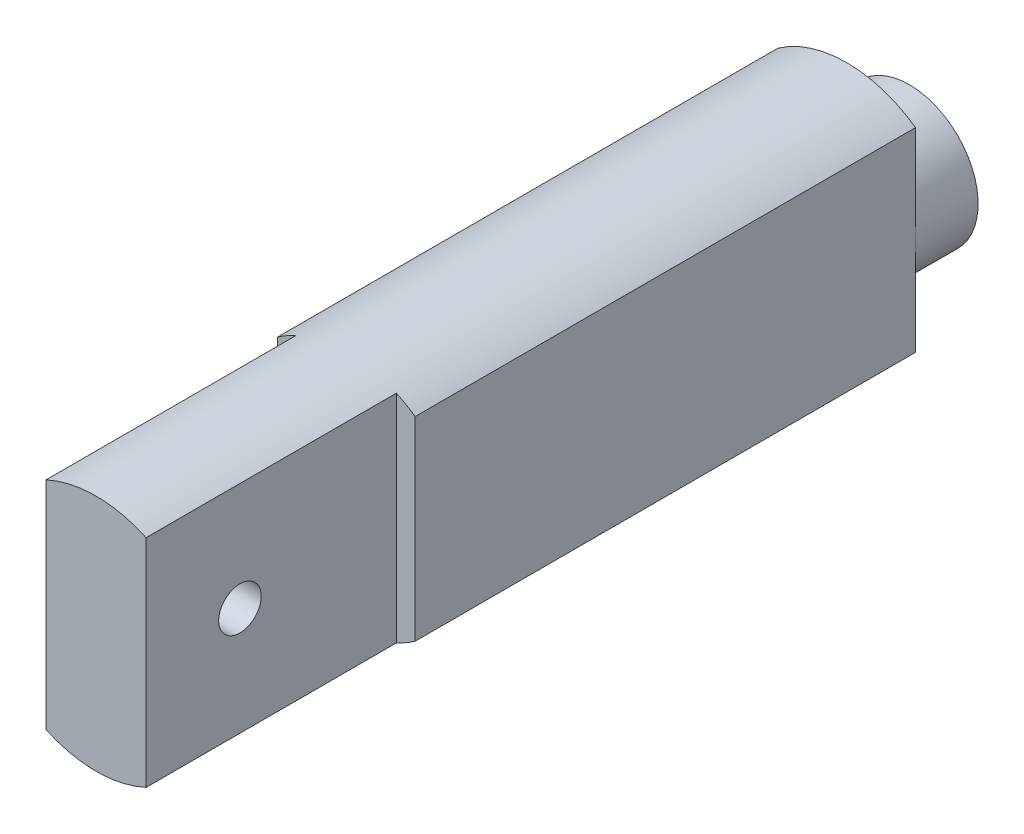
ISO-10303-21;
HEADER;
FILE_DESCRIPTION(('STEP AP214'),'2;1');
FILE_NAME('part.step','',(''),(''),'','','');
FILE_SCHEMA(('AUTOMOTIVE_DESIGN { 1 0 10303 214 1 1 1 1 }'));
ENDSEC;
DATA;
#1=APPLICATION_CONTEXT('core data for automotive mechanical design processes');
#2=APPLICATION_PROTOCOL_DEFINITION('international standard','automotive_design',2000,#1);
#3=PRODUCT_CONTEXT('',#1,'mechanical');
#4=PRODUCT('Part','Part','',(#3));
#5=PRODUCT_RELATED_PRODUCT_CATEGORY('part','',(#4));
#6=PRODUCT_DEFINITION_FORMATION('','',#4);
#7=PRODUCT_DEFINITION_CONTEXT('part definition',#1,'design');
#8=PRODUCT_DEFINITION('design','',#6,#7);
#9=PRODUCT_DEFINITION_SHAPE('','',#8);
#10=(LENGTH_UNIT() NAMED_UNIT(*) SI_UNIT(.MILLI.,.METRE.));
#11=(NAMED_UNIT(*) PLANE_ANGLE_UNIT() SI_UNIT($,.RADIAN.));
#12=(NAMED_UNIT(*) SI_UNIT($,.STERADIAN.) SOLID_ANGLE_UNIT());
#13=UNCERTAINTY_MEASURE_WITH_UNIT(LENGTH_MEASURE(1.E-05),#10,'distance_accuracy_value','');
#14=(GEOMETRIC_REPRESENTATION_CONTEXT(3) GLOBAL_UNCERTAINTY_ASSIGNED_CONTEXT((#13)) GLOBAL_UNIT_ASSIGNED_CONTEXT((#10,
#11,#12)) REPRESENTATION_CONTEXT('',''));
#15=CARTESIAN_POINT('',(0.,0.,0.));
#16=DIRECTION('',(0.,0.,1.));
#17=DIRECTION('',(1.,0.,0.));
#18=AXIS2_PLACEMENT_3D('',#15,#16,#17);
#19=CARTESIAN_POINT('',(0.,0.,120.));
#20=DIRECTION('',(0.,0.,-1.));
#21=DIRECTION('',(-1.,0.,0.));
#22=AXIS2_PLACEMENT_3D('',#19,#20,#21);
#23=CYLINDRICAL_SURFACE('',#22,19.05);
#24=CARTESIAN_POINT('',(0.,0.,80.));
#25=DIRECTION('',(0.,0.,1.));
#26=DIRECTION('',(1.,0.,0.));
#27=AXIS2_PLACEMENT_3D('',#24,#25,#26);
#28=CIRCLE('',#27,19.05);
#29=CARTESIAN_POINT('',(-8.,17.2887969506267,80.));
#30=VERTEX_POINT('',#29);
#31=CARTESIAN_POINT('',(-11.,15.5532151017081,80.));
#32=VERTEX_POINT('',#31);
#33=EDGE_CURVE('E68',#30,#32,#28,.T.);
#34=ORIENTED_EDGE('',*,*,#33,.F.);
#35=DIRECTION('',(0.,0.,-1.));
#36=VECTOR('',#35,1.);
#37=CARTESIAN_POINT('',(-8.,17.2887969506267,120.));
#38=LINE('',#37,#36);
#39=CARTESIAN_POINT('',(-8.,17.2887969506267,120.));
#40=VERTEX_POINT('',#39);
#41=EDGE_CURVE('E143',#40,#30,#38,.T.);
#42=ORIENTED_EDGE('',*,*,#41,.F.);
#43=CARTESIAN_POINT('',(0.,0.,120.));
#44=DIRECTION('',(0.,0.,1.));
#45=DIRECTION('',(1.,0.,0.));
#46=AXIS2_PLACEMENT_3D('',#43,#44,#45);
#47=CIRCLE('',#46,19.05);
#48=CARTESIAN_POINT('',(8.,17.2887969506267,120.));
#49=VERTEX_POINT('',#48);
#50=EDGE_CURVE('E126',#49,#40,#47,.T.);
#51=ORIENTED_EDGE('',*,*,#50,.F.);
#52=DIRECTION('',(0.,0.,-1.));
#53=VECTOR('',#52,1.);
#54=CARTESIAN_POINT('',(8.,17.2887969506267,120.));
#55=LINE('',#54,#53);
#56=CARTESIAN_POINT('',(8.,17.2887969506267,80.));
#57=VERTEX_POINT('',#56);
#58=EDGE_CURVE('E157',#57,#49,#55,.F.);
#59=ORIENTED_EDGE('',*,*,#58,.F.);
#60=CARTESIAN_POINT('',(11.,15.5532151017081,80.));
#61=VERTEX_POINT('',#60);
#62=EDGE_CURVE('E289',#61,#57,#28,.T.);
#63=ORIENTED_EDGE('',*,*,#62,.F.);
#64=DIRECTION('',(0.,0.,-1.));
#65=VECTOR('',#64,1.);
#66=CARTESIAN_POINT('',(11.,15.5532151017081,120.));
#67=LINE('',#66,#65);
#68=CARTESIAN_POINT('',(11.,15.5532151017081,0.));
#69=VERTEX_POINT('',#68);
#70=EDGE_CURVE('E173',#69,#61,#67,.F.);
#71=ORIENTED_EDGE('',*,*,#70,.F.);
#72=CARTESIAN_POINT('',(0.,0.,0.));
#73=DIRECTION('',(0.,0.,1.));
#74=DIRECTION('',(1.,0.,0.));
#75=AXIS2_PLACEMENT_3D('',#72,#73,#74);
#76=CIRCLE('',#75,19.05);
#77=CARTESIAN_POINT('',(-11.,15.5532151017081,0.));
#78=VERTEX_POINT('',#77);
#79=EDGE_CURVE('E187',#69,#78,#76,.T.);
#80=ORIENTED_EDGE('',*,*,#79,.T.);
#81=DIRECTION('',(0.,0.,-1.));
#82=VECTOR('',#81,1.);
#83=CARTESIAN_POINT('',(-11.,15.5532151017081,120.));
#84=LINE('',#83,#82);
#85=EDGE_CURVE('E170',#32,#78,#84,.T.);
#86=ORIENTED_EDGE('',*,*,#85,.F.);
#87=EDGE_LOOP('',(#34,#42,#51,#59,#63,#71,#80,#86));
#88=FACE_BOUND('',#87,.T.);
#89=ADVANCED_FACE('F53',(#88),#23,.T.);
#90=CARTESIAN_POINT('',(0.,0.,80.));
#91=DIRECTION('',(0.,0.,1.));
#92=DIRECTION('',(1.,0.,0.));
#93=AXIS2_PLACEMENT_3D('',#90,#91,#92);
#94=CIRCLE('',#93,19.05);
#95=CARTESIAN_POINT('',(-11.,-15.5532151017081,80.));
#96=VERTEX_POINT('',#95);
#97=CARTESIAN_POINT('',(-8.,-17.2887969506267,80.));
#98=VERTEX_POINT('',#97);
#99=EDGE_CURVE('E290',#96,#98,#94,.T.);
#100=ORIENTED_EDGE('',*,*,#99,.F.);
#101=DIRECTION('',(0.,0.,-1.));
#102=VECTOR('',#101,1.);
#103=CARTESIAN_POINT('',(-11.,-15.5532151017081,120.));
#104=LINE('',#103,#102);
#105=CARTESIAN_POINT('',(-11.,-15.5532151017081,0.));
#106=VERTEX_POINT('',#105);
#107=EDGE_CURVE('E166',#106,#96,#104,.F.);
#108=ORIENTED_EDGE('',*,*,#107,.F.);
#109=CARTESIAN_POINT('',(11.,-15.5532151017081,0.));
#110=VERTEX_POINT('',#109);
#111=EDGE_CURVE('E184',#106,#110,#76,.T.);
#112=ORIENTED_EDGE('',*,*,#111,.T.);
#113=DIRECTION('',(0.,0.,-1.));
#114=VECTOR('',#113,1.);
#115=CARTESIAN_POINT('',(11.,-15.5532151017081,120.));
#116=LINE('',#115,#114);
#117=CARTESIAN_POINT('',(11.,-15.5532151017081,80.));
#118=VERTEX_POINT('',#117);
#119=EDGE_CURVE('E177',#118,#110,#116,.T.);
#120=ORIENTED_EDGE('',*,*,#119,.F.);
#121=CARTESIAN_POINT('',(8.,-17.2887969506267,80.));
#122=VERTEX_POINT('',#121);
#123=EDGE_CURVE('E76',#122,#118,#94,.T.);
#124=ORIENTED_EDGE('',*,*,#123,.F.);
#125=DIRECTION('',(0.,0.,-1.));
#126=VECTOR('',#125,1.);
#127=CARTESIAN_POINT('',(8.,-17.2887969506267,120.));
#128=LINE('',#127,#126);
#129=CARTESIAN_POINT('',(8.,-17.2887969506267,120.));
#130=VERTEX_POINT('',#129);
#131=EDGE_CURVE('E296',#130,#122,#128,.T.);
#132=ORIENTED_EDGE('',*,*,#131,.F.);
#133=CARTESIAN_POINT('',(-8.,-17.2887969506267,120.));
#134=VERTEX_POINT('',#133);
#135=EDGE_CURVE('E138',#134,#130,#47,.T.);
#136=ORIENTED_EDGE('',*,*,#135,.F.);
#137=DIRECTION('',(0.,0.,-1.));
#138=VECTOR('',#137,1.);
#139=CARTESIAN_POINT('',(-8.,-17.2887969506267,120.));
#140=LINE('',#139,#138);
#141=EDGE_CURVE('E145',#98,#134,#140,.F.);
#142=ORIENTED_EDGE('',*,*,#141,.F.);
#143=EDGE_LOOP('',(#100,#108,#112,#120,#124,#132,#136,#142));
#144=FACE_BOUND('',#143,.T.);
#145=ADVANCED_FACE('F200',(#144),#23,.T.);
#146=CARTESIAN_POINT('',(0.,0.,120.));
#147=DIRECTION('',(0.,0.,1.));
#148=DIRECTION('',(1.,0.,0.));
#149=AXIS2_PLACEMENT_3D('',#146,#147,#148);
#150=PLANE('',#149);
#151=ORIENTED_EDGE('',*,*,#50,.T.);
#152=DIRECTION('',(0.,-1.,0.));
#153=VECTOR('',#152,1.);
#154=CARTESIAN_POINT('',(-8.,19.05,120.));
#155=LINE('',#154,#153);
#156=EDGE_CURVE('E129',#40,#134,#155,.T.);
#157=ORIENTED_EDGE('',*,*,#156,.T.);
#158=ORIENTED_EDGE('',*,*,#135,.T.);
#159=DIRECTION('',(0.,1.,0.));
#160=VECTOR('',#159,1.);
#161=CARTESIAN_POINT('',(8.,19.05,120.));
#162=LINE('',#161,#160);
#163=EDGE_CURVE('E132',#130,#49,#162,.T.);
#164=ORIENTED_EDGE('',*,*,#163,.T.);
#165=EDGE_LOOP('',(#151,#157,#158,#164));
#166=FACE_BOUND('',#165,.T.);
#167=ADVANCED_FACE('F128',(#166),#150,.T.);
#168=CARTESIAN_POINT('',(-11.,19.05,120.));
#169=DIRECTION('',(-1.,0.,0.));
#170=DIRECTION('',(0.,0.,1.));
#171=AXIS2_PLACEMENT_3D('',#168,#169,#170);
#172=PLANE('',#171);
#173=ORIENTED_EDGE('',*,*,#107,.T.);
#174=DIRECTION('',(0.,1.,0.));
#175=VECTOR('',#174,1.);
#176=CARTESIAN_POINT('',(-11.,19.05,80.));
#177=LINE('',#176,#175);
#178=EDGE_CURVE('E293',#96,#32,#177,.T.);
#179=ORIENTED_EDGE('',*,*,#178,.T.);
#180=ORIENTED_EDGE('',*,*,#85,.T.);
#181=DIRECTION('',(0.,1.,0.));
#182=VECTOR('',#181,1.);
#183=CARTESIAN_POINT('',(-11.,19.05,0.));
#184=LINE('',#183,#182);
#185=CARTESIAN_POINT('',(-11.,0.,0.));
#186=VERTEX_POINT('',#185);
#187=EDGE_CURVE('E161',#186,#78,#184,.T.);
#188=ORIENTED_EDGE('',*,*,#187,.F.);
#189=EDGE_CURVE('E165',#106,#186,#184,.T.);
#190=ORIENTED_EDGE('',*,*,#189,.F.);
#191=EDGE_LOOP('',(#173,#179,#180,#188,#190));
#192=FACE_BOUND('',#191,.T.);
#193=ADVANCED_FACE('F238',(#192),#172,.T.);
#194=CARTESIAN_POINT('',(11.,19.05,120.));
#195=DIRECTION('',(1.,0.,0.));
#196=DIRECTION('',(0.,0.,-1.));
#197=AXIS2_PLACEMENT_3D('',#194,#195,#196);
#198=PLANE('',#197);
#199=ORIENTED_EDGE('',*,*,#70,.T.);
#200=DIRECTION('',(0.,-1.,0.));
#201=VECTOR('',#200,1.);
#202=CARTESIAN_POINT('',(11.,19.05,80.));
#203=LINE('',#202,#201);
#204=EDGE_CURVE('E14',#61,#118,#203,.T.);
#205=ORIENTED_EDGE('',*,*,#204,.T.);
#206=ORIENTED_EDGE('',*,*,#119,.T.);
#207=DIRECTION('',(0.,-1.,0.));
#208=VECTOR('',#207,1.);
#209=CARTESIAN_POINT('',(11.,19.05,0.));
#210=LINE('',#209,#208);
#211=CARTESIAN_POINT('',(11.,0.,0.));
#212=VERTEX_POINT('',#211);
#213=EDGE_CURVE('E150',#212,#110,#210,.T.);
#214=ORIENTED_EDGE('',*,*,#213,.F.);
#215=EDGE_CURVE('E155',#69,#212,#210,.T.);
#216=ORIENTED_EDGE('',*,*,#215,.F.);
#217=EDGE_LOOP('',(#199,#205,#206,#214,#216));
#218=FACE_BOUND('',#217,.T.);
#219=ADVANCED_FACE('F208',(#218),#198,.T.);
#220=CARTESIAN_POINT('',(0.,0.,0.));
#221=DIRECTION('',(0.,0.,1.));
#222=DIRECTION('',(1.,0.,0.));
#223=AXIS2_PLACEMENT_3D('',#220,#221,#222);
#224=PLANE('',#223);
#225=ORIENTED_EDGE('',*,*,#213,.T.);
#226=ORIENTED_EDGE('',*,*,#111,.F.);
#227=ORIENTED_EDGE('',*,*,#189,.T.);
#228=CARTESIAN_POINT('',(0.,0.,0.));
#229=DIRECTION('',(0.,0.,-1.));
#230=DIRECTION('',(-1.,0.,0.));
#231=AXIS2_PLACEMENT_3D('',#228,#229,#230);
#232=CIRCLE('',#231,11.);
#233=EDGE_CURVE('E137',#212,#186,#232,.T.);
#234=ORIENTED_EDGE('',*,*,#233,.F.);
#235=EDGE_LOOP('',(#225,#226,#227,#234));
#236=FACE_BOUND('',#235,.T.);
#237=ADVANCED_FACE('F204',(#236),#224,.F.);
#238=ORIENTED_EDGE('',*,*,#215,.T.);
#239=EDGE_CURVE('E61',#186,#212,#232,.T.);
#240=ORIENTED_EDGE('',*,*,#239,.F.);
#241=ORIENTED_EDGE('',*,*,#187,.T.);
#242=ORIENTED_EDGE('',*,*,#79,.F.);
#243=EDGE_LOOP('',(#238,#240,#241,#242));
#244=FACE_BOUND('',#243,.T.);
#245=ADVANCED_FACE('F211',(#244),#224,.F.);
#246=CARTESIAN_POINT('',(0.,0.,-10.));
#247=DIRECTION('',(0.,0.,1.));
#248=DIRECTION('',(1.,0.,0.));
#249=AXIS2_PLACEMENT_3D('',#246,#247,#248);
#250=CYLINDRICAL_SURFACE('',#249,11.);
#251=CARTESIAN_POINT('',(0.,0.,-10.));
#252=DIRECTION('',(0.,0.,-1.));
#253=DIRECTION('',(-1.,0.,0.));
#254=AXIS2_PLACEMENT_3D('',#251,#252,#253);
#255=CIRCLE('',#254,11.);
#256=CARTESIAN_POINT('',(-11.,0.,-10.));
#257=VERTEX_POINT('',#256);
#258=EDGE_CURVE('E180',#257,#257,#255,.T.);
#259=ORIENTED_EDGE('',*,*,#258,.F.);
#260=EDGE_LOOP('',(#259));
#261=FACE_BOUND('',#260,.T.);
#262=ORIENTED_EDGE('',*,*,#239,.T.);
#263=ORIENTED_EDGE('',*,*,#233,.T.);
#264=EDGE_LOOP('',(#262,#263));
#265=FACE_BOUND('',#264,.T.);
#266=ADVANCED_FACE('F216',(#261,#265),#250,.T.);
#267=CARTESIAN_POINT('',(0.,0.,-10.));
#268=DIRECTION('',(0.,0.,-1.));
#269=DIRECTION('',(-1.,0.,0.));
#270=AXIS2_PLACEMENT_3D('',#267,#268,#269);
#271=PLANE('',#270);
#272=ORIENTED_EDGE('',*,*,#258,.T.);
#273=EDGE_LOOP('',(#272));
#274=FACE_BOUND('',#273,.T.);
#275=ADVANCED_FACE('F219',(#274),#271,.T.);
#276=CARTESIAN_POINT('',(0.,0.,80.));
#277=DIRECTION('',(0.,0.,1.));
#278=DIRECTION('',(1.,0.,0.));
#279=AXIS2_PLACEMENT_3D('',#276,#277,#278);
#280=PLANE('',#279);
#281=ORIENTED_EDGE('',*,*,#62,.T.);
#282=DIRECTION('',(0.,1.,0.));
#283=VECTOR('',#282,1.);
#284=CARTESIAN_POINT('',(8.,19.05,80.));
#285=LINE('',#284,#283);
#286=EDGE_CURVE('E280',#122,#57,#285,.T.);
#287=ORIENTED_EDGE('',*,*,#286,.F.);
#288=ORIENTED_EDGE('',*,*,#123,.T.);
#289=ORIENTED_EDGE('',*,*,#204,.F.);
#290=EDGE_LOOP('',(#281,#287,#288,#289));
#291=FACE_BOUND('',#290,.T.);
#292=ADVANCED_FACE('F226',(#291),#280,.T.);
#293=CARTESIAN_POINT('',(8.,19.05,80.));
#294=DIRECTION('',(1.,0.,0.));
#295=DIRECTION('',(0.,0.,-1.));
#296=AXIS2_PLACEMENT_3D('',#293,#294,#295);
#297=PLANE('',#296);
#298=CARTESIAN_POINT('',(8.,0.,105.));
#299=DIRECTION('',(1.,0.,0.));
#300=DIRECTION('',(0.,0.,-1.));
#301=AXIS2_PLACEMENT_3D('',#298,#299,#300);
#302=CIRCLE('',#301,3.39999999999999);
#303=CARTESIAN_POINT('',(8.,0.,101.6));
#304=VERTEX_POINT('',#303);
#305=EDGE_CURVE('E271',#304,#304,#302,.T.);
#306=ORIENTED_EDGE('',*,*,#305,.F.);
#307=EDGE_LOOP('',(#306));
#308=FACE_BOUND('',#307,.T.);
#309=ORIENTED_EDGE('',*,*,#58,.T.);
#310=ORIENTED_EDGE('',*,*,#163,.F.);
#311=ORIENTED_EDGE('',*,*,#131,.T.);
#312=ORIENTED_EDGE('',*,*,#286,.T.);
#313=EDGE_LOOP('',(#309,#310,#311,#312));
#314=FACE_BOUND('',#313,.T.);
#315=ADVANCED_FACE('F257',(#308,#314),#297,.T.);
#316=CARTESIAN_POINT('',(-8.,19.05,80.));
#317=DIRECTION('',(-1.,0.,0.));
#318=DIRECTION('',(0.,0.,1.));
#319=AXIS2_PLACEMENT_3D('',#316,#317,#318);
#320=PLANE('',#319);
#321=CARTESIAN_POINT('',(-8.,0.,105.));
#322=DIRECTION('',(-1.,0.,0.));
#323=DIRECTION('',(0.,0.,1.));
#324=AXIS2_PLACEMENT_3D('',#321,#322,#323);
#325=CIRCLE('',#324,3.39999999999999);
#326=CARTESIAN_POINT('',(-8.,0.,108.4));
#327=VERTEX_POINT('',#326);
#328=EDGE_CURVE('E147',#327,#327,#325,.T.);
#329=ORIENTED_EDGE('',*,*,#328,.F.);
#330=EDGE_LOOP('',(#329));
#331=FACE_BOUND('',#330,.T.);
#332=ORIENTED_EDGE('',*,*,#41,.T.);
#333=DIRECTION('',(0.,-1.,0.));
#334=VECTOR('',#333,1.);
#335=CARTESIAN_POINT('',(-8.,19.05,80.));
#336=LINE('',#335,#334);
#337=EDGE_CURVE('E277',#30,#98,#336,.T.);
#338=ORIENTED_EDGE('',*,*,#337,.T.);
#339=ORIENTED_EDGE('',*,*,#141,.T.);
#340=ORIENTED_EDGE('',*,*,#156,.F.);
#341=EDGE_LOOP('',(#332,#338,#339,#340));
#342=FACE_BOUND('',#341,.T.);
#343=ADVANCED_FACE('F141',(#331,#342),#320,.T.);
#344=ORIENTED_EDGE('',*,*,#33,.T.);
#345=ORIENTED_EDGE('',*,*,#178,.F.);
#346=ORIENTED_EDGE('',*,*,#99,.T.);
#347=ORIENTED_EDGE('',*,*,#337,.F.);
#348=EDGE_LOOP('',(#344,#345,#346,#347));
#349=FACE_BOUND('',#348,.T.);
#350=ADVANCED_FACE('F251',(#349),#280,.T.);
#351=CARTESIAN_POINT('',(8.,0.,105.));
#352=DIRECTION('',(1.,0.,0.));
#353=DIRECTION('',(0.,0.,-1.));
#354=AXIS2_PLACEMENT_3D('',#351,#352,#353);
#355=CYLINDRICAL_SURFACE('',#354,3.39999999999999);
#356=ORIENTED_EDGE('',*,*,#328,.T.);
#357=EDGE_LOOP('',(#356));
#358=FACE_BOUND('',#357,.T.);
#359=ORIENTED_EDGE('',*,*,#305,.T.);
#360=EDGE_LOOP('',(#359));
#361=FACE_BOUND('',#360,.T.);
#362=ADVANCED_FACE('F254',(#358,#361),#355,.F.);
#363=CLOSED_SHELL('',(#89,#145,#167,#193,#219,#237,#245,#266,#275,#292,#315,#343,#350,#362));
#364=MANIFOLD_SOLID_BREP('B2',#363);
#365=ADVANCED_BREP_SHAPE_REPRESENTATION('',(#18,#364),#14);
#366=SHAPE_DEFINITION_REPRESENTATION(#9,#365);
ENDSEC;
END-ISO-10303-21;
